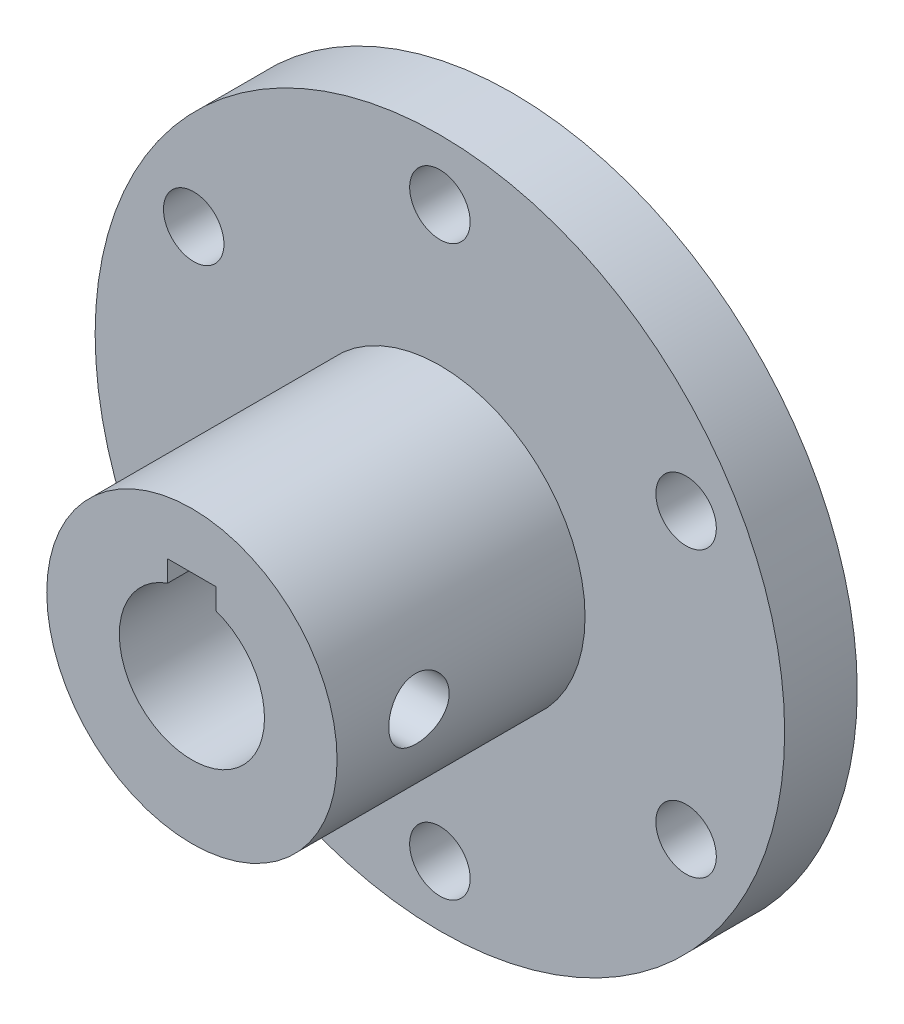
ISO-10303-21;
HEADER;
FILE_DESCRIPTION(('STEP AP214'),'2;1');
FILE_NAME('part.step','',(''),(''),'','','');
FILE_SCHEMA(('AUTOMOTIVE_DESIGN { 1 0 10303 214 1 1 1 1 }'));
ENDSEC;
DATA;
#1=APPLICATION_CONTEXT('core data for automotive mechanical design processes');
#2=APPLICATION_PROTOCOL_DEFINITION('international standard','automotive_design',2000,#1);
#3=PRODUCT_CONTEXT('',#1,'mechanical');
#4=PRODUCT('Part','Part','',(#3));
#5=PRODUCT_RELATED_PRODUCT_CATEGORY('part','',(#4));
#6=PRODUCT_DEFINITION_FORMATION('','',#4);
#7=PRODUCT_DEFINITION_CONTEXT('part definition',#1,'design');
#8=PRODUCT_DEFINITION('design','',#6,#7);
#9=PRODUCT_DEFINITION_SHAPE('','',#8);
#10=(LENGTH_UNIT() NAMED_UNIT(*) SI_UNIT(.MILLI.,.METRE.));
#11=(NAMED_UNIT(*) PLANE_ANGLE_UNIT() SI_UNIT($,.RADIAN.));
#12=(NAMED_UNIT(*) SI_UNIT($,.STERADIAN.) SOLID_ANGLE_UNIT());
#13=UNCERTAINTY_MEASURE_WITH_UNIT(LENGTH_MEASURE(1.E-05),#10,'distance_accuracy_value','');
#14=(GEOMETRIC_REPRESENTATION_CONTEXT(3) GLOBAL_UNCERTAINTY_ASSIGNED_CONTEXT((#13)) GLOBAL_UNIT_ASSIGNED_CONTEXT((#10,
#11,#12)) REPRESENTATION_CONTEXT('',''));
#15=CARTESIAN_POINT('',(0.,0.,0.));
#16=DIRECTION('',(0.,0.,1.));
#17=DIRECTION('',(1.,0.,0.));
#18=AXIS2_PLACEMENT_3D('',#15,#16,#17);
#19=CARTESIAN_POINT('',(0.,0.,0.));
#20=DIRECTION('',(0.,0.,1.));
#21=DIRECTION('',(1.,0.,0.));
#22=AXIS2_PLACEMENT_3D('',#19,#20,#21);
#23=PLANE('',#22);
#24=CARTESIAN_POINT('',(0.,0.,0.));
#25=DIRECTION('',(0.,0.,1.));
#26=DIRECTION('',(1.,0.,0.));
#27=AXIS2_PLACEMENT_3D('',#24,#25,#26);
#28=CIRCLE('',#27,28.5);
#29=CARTESIAN_POINT('',(28.5,0.,0.));
#30=VERTEX_POINT('',#29);
#31=EDGE_CURVE('E156',#30,#30,#28,.T.);
#32=ORIENTED_EDGE('',*,*,#31,.F.);
#33=EDGE_LOOP('',(#32));
#34=FACE_BOUND('',#33,.T.);
#35=CARTESIAN_POINT('',(-20.351596988934,11.7499999999994,0.));
#36=DIRECTION('',(0.,0.,1.));
#37=DIRECTION('',(1.,0.,0.));
#38=AXIS2_PLACEMENT_3D('',#35,#36,#37);
#39=CIRCLE('',#38,2.5);
#40=CARTESIAN_POINT('',(-17.851596988934,11.7499999999994,0.));
#41=VERTEX_POINT('',#40);
#42=EDGE_CURVE('E129',#41,#41,#39,.T.);
#43=ORIENTED_EDGE('',*,*,#42,.T.);
#44=EDGE_LOOP('',(#43));
#45=FACE_BOUND('',#44,.T.);
#46=CARTESIAN_POINT('',(20.3515969889352,-11.7499999999995,0.));
#47=DIRECTION('',(0.,0.,1.));
#48=DIRECTION('',(1.,0.,0.));
#49=AXIS2_PLACEMENT_3D('',#46,#47,#48);
#50=CIRCLE('',#49,2.5);
#51=CARTESIAN_POINT('',(22.8515969889352,-11.7499999999995,0.));
#52=VERTEX_POINT('',#51);
#53=EDGE_CURVE('E114',#52,#52,#50,.T.);
#54=ORIENTED_EDGE('',*,*,#53,.T.);
#55=EDGE_LOOP('',(#54));
#56=FACE_BOUND('',#55,.T.);
#57=CARTESIAN_POINT('',(1.23907396518432E-12,-23.5,0.));
#58=DIRECTION('',(0.,0.,1.));
#59=DIRECTION('',(1.,0.,0.));
#60=AXIS2_PLACEMENT_3D('',#57,#58,#59);
#61=CIRCLE('',#60,2.5);
#62=CARTESIAN_POINT('',(2.50000000000124,-23.5,0.));
#63=VERTEX_POINT('',#62);
#64=EDGE_CURVE('E247',#63,#63,#61,.T.);
#65=ORIENTED_EDGE('',*,*,#64,.T.);
#66=EDGE_LOOP('',(#65));
#67=FACE_BOUND('',#66,.T.);
#68=CARTESIAN_POINT('',(-20.3515969889334,-11.7500000000005,0.));
#69=DIRECTION('',(0.,0.,1.));
#70=DIRECTION('',(1.,0.,0.));
#71=AXIS2_PLACEMENT_3D('',#68,#69,#70);
#72=CIRCLE('',#71,2.5);
#73=CARTESIAN_POINT('',(-17.8515969889334,-11.7500000000005,0.));
#74=VERTEX_POINT('',#73);
#75=EDGE_CURVE('E249',#74,#74,#72,.T.);
#76=ORIENTED_EDGE('',*,*,#75,.T.);
#77=EDGE_LOOP('',(#76));
#78=FACE_BOUND('',#77,.T.);
#79=CARTESIAN_POINT('',(0.,23.5,0.));
#80=DIRECTION('',(0.,0.,1.));
#81=DIRECTION('',(1.,0.,0.));
#82=AXIS2_PLACEMENT_3D('',#79,#80,#81);
#83=CIRCLE('',#82,2.5);
#84=CARTESIAN_POINT('',(2.49999999999999,23.5,0.));
#85=VERTEX_POINT('',#84);
#86=EDGE_CURVE('E253',#85,#85,#83,.T.);
#87=ORIENTED_EDGE('',*,*,#86,.T.);
#88=EDGE_LOOP('',(#87));
#89=FACE_BOUND('',#88,.T.);
#90=CARTESIAN_POINT('',(20.3515969889346,11.7500000000005,0.));
#91=DIRECTION('',(0.,0.,1.));
#92=DIRECTION('',(1.,0.,0.));
#93=AXIS2_PLACEMENT_3D('',#90,#91,#92);
#94=CIRCLE('',#93,2.5);
#95=CARTESIAN_POINT('',(22.8515969889346,11.7500000000005,0.));
#96=VERTEX_POINT('',#95);
#97=EDGE_CURVE('E39',#96,#96,#94,.T.);
#98=ORIENTED_EDGE('',*,*,#97,.T.);
#99=EDGE_LOOP('',(#98));
#100=FACE_BOUND('',#99,.T.);
#101=DIRECTION('',(0.,-1.,0.));
#102=VECTOR('',#101,1.);
#103=CARTESIAN_POINT('',(2.,0.,0.));
#104=LINE('',#103,#102);
#105=CARTESIAN_POINT('',(2.,7.4,0.));
#106=VERTEX_POINT('',#105);
#107=CARTESIAN_POINT('',(2.,5.65685424949238,0.));
#108=VERTEX_POINT('',#107);
#109=EDGE_CURVE('E57',#106,#108,#104,.T.);
#110=ORIENTED_EDGE('',*,*,#109,.F.);
#111=DIRECTION('',(1.,0.,0.));
#112=VECTOR('',#111,1.);
#113=CARTESIAN_POINT('',(0.,7.4,0.));
#114=LINE('',#113,#112);
#115=CARTESIAN_POINT('',(-2.,7.4,0.));
#116=VERTEX_POINT('',#115);
#117=EDGE_CURVE('E105',#116,#106,#114,.T.);
#118=ORIENTED_EDGE('',*,*,#117,.F.);
#119=DIRECTION('',(0.,1.,0.));
#120=VECTOR('',#119,1.);
#121=CARTESIAN_POINT('',(-2.,0.,0.));
#122=LINE('',#121,#120);
#123=CARTESIAN_POINT('',(-2.,5.65685424949238,0.));
#124=VERTEX_POINT('',#123);
#125=EDGE_CURVE('E84',#124,#116,#122,.T.);
#126=ORIENTED_EDGE('',*,*,#125,.F.);
#127=CARTESIAN_POINT('',(0.,0.,0.));
#128=DIRECTION('',(0.,0.,1.));
#129=DIRECTION('',(1.,0.,0.));
#130=AXIS2_PLACEMENT_3D('',#127,#128,#129);
#131=CIRCLE('',#130,6.);
#132=EDGE_CURVE('E204',#124,#108,#131,.T.);
#133=ORIENTED_EDGE('',*,*,#132,.T.);
#134=EDGE_LOOP('',(#110,#118,#126,#133));
#135=FACE_BOUND('',#134,.T.);
#136=ADVANCED_FACE('F35',(#34,#45,#56,#67,#78,#89,#100,#135),#23,.F.);
#137=CARTESIAN_POINT('',(0.,0.,6.));
#138=DIRECTION('',(0.,0.,-1.));
#139=DIRECTION('',(-1.,0.,0.));
#140=AXIS2_PLACEMENT_3D('',#137,#138,#139);
#141=CYLINDRICAL_SURFACE('',#140,6.);
#142=CARTESIAN_POINT('',(5.42225065151419,2.56889039706912,19.7283273714897));
#143=CARTESIAN_POINT('',(5.42225195363247,2.56888891370338,19.6616191894606));
#144=CARTESIAN_POINT('',(5.4235138193724,2.56623067981336,19.5948925815696));
#145=CARTESIAN_POINT('',(5.42851428925408,2.55563284074856,19.4619408975699));
#146=CARTESIAN_POINT('',(5.43225436530629,2.54769009687566,19.3957161431899));
#147=CARTESIAN_POINT('',(5.44705154971853,2.51599296927434,19.1982755136197));
#148=CARTESIAN_POINT('',(5.46168510681385,2.48436997248092,19.0684905661244));
#149=CARTESIAN_POINT('',(5.49855540816879,2.40164355651586,18.8171726225907));
#150=CARTESIAN_POINT('',(5.52076112130537,2.35061954711991,18.6956083366361));
#151=CARTESIAN_POINT('',(5.57027327993751,2.23075098336058,18.4628172160337));
#152=CARTESIAN_POINT('',(5.59757851841122,2.16191064451292,18.351587944471));
#153=CARTESIAN_POINT('',(5.65618706374671,2.00375615049626,18.1356734162513));
#154=CARTESIAN_POINT('',(5.68762903099454,1.9135058875006,18.0317116032916));
#155=CARTESIAN_POINT('',(5.74999761965651,1.71701702186133,17.8399276389207));
#156=CARTESIAN_POINT('',(5.78092403821316,1.61077228331397,17.7521117103414));
#157=CARTESIAN_POINT('',(5.84050352272035,1.37961985035588,17.5914281537892));
#158=CARTESIAN_POINT('',(5.86899980201108,1.25410254701607,17.5193741030954));
#159=CARTESIAN_POINT('',(5.91904811145496,0.991320893666393,17.3977754246359));
#160=CARTESIAN_POINT('',(5.940603223003,0.854061790543748,17.348220804674));
#161=CARTESIAN_POINT('',(5.97349224286801,0.579250443236474,17.2756484865349));
#162=CARTESIAN_POINT('',(5.98529968211897,0.442085163424809,17.2513840242942));
#163=CARTESIAN_POINT('',(5.99932572945772,0.165165828999258,17.2260521395105));
#164=CARTESIAN_POINT('',(6.00154822668798,0.0254128474805444,17.2249753077516));
#165=CARTESIAN_POINT('',(5.99646999537446,-0.243647058056589,17.2453959796862));
#166=CARTESIAN_POINT('',(5.9897406094826,-0.373072098827291,17.2655236193667));
#167=CARTESIAN_POINT('',(5.96854657036551,-0.626611714643536,17.3254336235311));
#168=CARTESIAN_POINT('',(5.95408134689086,-0.750725897469163,17.365217436959));
#169=CARTESIAN_POINT('',(5.9186425609577,-0.992383643529205,17.4637834983214));
#170=CARTESIAN_POINT('',(5.89757306894909,-1.10979806975317,17.5228463416616));
#171=CARTESIAN_POINT('',(5.85107425107116,-1.333414193718,17.6580189278126));
#172=CARTESIAN_POINT('',(5.82564338513003,-1.43961190917841,17.7341346952059));
#173=CARTESIAN_POINT('',(5.77094344384917,-1.64571255992642,17.9074922520631));
#174=CARTESIAN_POINT('',(5.74153017540904,-1.74464412809922,18.0058449923935));
#175=CARTESIAN_POINT('',(5.68359773086639,-1.92502238908887,18.2177502881529));
#176=CARTESIAN_POINT('',(5.65507890339245,-2.00646233473593,18.3313086816461));
#177=CARTESIAN_POINT('',(5.60134161994031,-2.15202349999705,18.5751174742253));
#178=CARTESIAN_POINT('',(5.57626243921726,-2.2154875532682,18.7057938098604));
#179=CARTESIAN_POINT('',(5.53401615508048,-2.31901456949934,18.977289483192));
#180=CARTESIAN_POINT('',(5.51684339617688,-2.35909426486993,19.1181014871793));
#181=CARTESIAN_POINT('',(5.49382073077735,-2.41220306587435,19.3961210032707));
#182=CARTESIAN_POINT('',(5.48730847785058,-2.42681851860183,19.5329696274007));
#183=CARTESIAN_POINT('',(5.48446788513199,-2.43323533232134,19.807284342521));
#184=CARTESIAN_POINT('',(5.48813602208797,-2.4250445861307,19.944750203457));
#185=CARTESIAN_POINT('',(5.50454748532928,-2.38753425532214,20.2071241413387));
#186=CARTESIAN_POINT('',(5.51669475852596,-2.35960096819507,20.3322727420665));
#187=CARTESIAN_POINT('',(5.54790527453022,-2.28524845036873,20.5760299575616));
#188=CARTESIAN_POINT('',(5.56697013378883,-2.23882489875145,20.6946370362851));
#189=CARTESIAN_POINT('',(5.61080466094886,-2.12664821688557,20.9275579793434));
#190=CARTESIAN_POINT('',(5.63578173303694,-2.06015974520393,21.0414773058101));
#191=CARTESIAN_POINT('',(5.68825702491187,-1.91050093057222,21.2571434576004));
#192=CARTESIAN_POINT('',(5.71575633306032,-1.82732336760903,21.3588849840602));
#193=CARTESIAN_POINT('',(5.77279313281953,-1.63869563914231,21.5559276161034));
#194=CARTESIAN_POINT('',(5.80231430286949,-1.53198354204752,21.6500301439234));
#195=CARTESIAN_POINT('',(5.85785015120914,-1.30360544474086,21.8192719236762));
#196=CARTESIAN_POINT('',(5.88386457245475,-1.18193834957853,21.8944097858541));
#197=CARTESIAN_POINT('',(5.92949399829139,-0.926273991762149,22.023507084567));
#198=CARTESIAN_POINT('',(5.94909245059206,-0.792245962499117,22.077411814234));
#199=CARTESIAN_POINT('',(5.97937965670684,-0.516017484669512,22.1615609137531));
#200=CARTESIAN_POINT('',(5.9900737133468,-0.373821954105474,22.191819364989));
#201=CARTESIAN_POINT('',(6.00072855105519,-0.0960287639170519,22.2260435754152));
#202=CARTESIAN_POINT('',(6.00138732410508,0.0393353363783025,22.2316993203226));
#203=CARTESIAN_POINT('',(5.99355821627965,0.308919580768309,22.2211010445474));
#204=CARTESIAN_POINT('',(5.98507193891218,0.443139921253078,22.2048508647597));
#205=CARTESIAN_POINT('',(5.96019063893748,0.701727759956212,22.1521151651253));
#206=CARTESIAN_POINT('',(5.94408684637824,0.826275874243718,22.1163679131032));
#207=CARTESIAN_POINT('',(5.90554194628013,1.06747634890412,22.0264588767995));
#208=CARTESIAN_POINT('',(5.88309963504297,1.18412720434945,21.9722935944957));
#209=CARTESIAN_POINT('',(5.83269791774769,1.41204594523301,21.844348075925));
#210=CARTESIAN_POINT('',(5.8045350120352,1.52283230075625,21.7697920004772));
#211=CARTESIAN_POINT('',(5.74596844859753,1.73076106992463,21.6043136804161));
#212=CARTESIAN_POINT('',(5.71556396151426,1.82789839457439,21.5133853601415));
#213=CARTESIAN_POINT('',(5.65325583306173,2.01267168702113,21.3104347980214));
#214=CARTESIAN_POINT('',(5.62139096185819,2.09921134603455,21.197398217493));
#215=CARTESIAN_POINT('',(5.56182667596352,2.25229911434537,20.957420940768));
#216=CARTESIAN_POINT('',(5.53412959410159,2.31883604818895,20.8304725259181));
#217=CARTESIAN_POINT('',(5.48652018637099,2.4293507632457,20.5663984055381));
#218=CARTESIAN_POINT('',(5.46656661291974,2.47344847486282,20.429331386265));
#219=CARTESIAN_POINT('',(5.44444541447372,2.52156700189772,20.219163576403));
#220=CARTESIAN_POINT('',(5.43837530851026,2.53459793579417,20.14841674891));
#221=CARTESIAN_POINT('',(5.42903044176588,2.5545564390546,20.0059012933206));
#222=CARTESIAN_POINT('',(5.42575370698212,2.56148831857326,19.9341334232931));
#223=CARTESIAN_POINT('',(5.42281360714943,2.56770222979306,19.817615753322));
#224=CARTESIAN_POINT('',(5.42224977999604,2.56889138989764,19.7729756895517));
#225=CARTESIAN_POINT('',(5.42225065151419,2.56889039706912,19.7283273714897));
#226=B_SPLINE_CURVE_WITH_KNOTS('',3,(#142,#143,#144,#145,#146,#147,#148,#149,#150,#151,#152,
#153,#154,#155,#156,#157,#158,#159,#160,#161,#162,#163,#164,#165,#166,#167,#168,#169,#170,#171,
#172,#173,#174,#175,#176,#177,#178,#179,#180,#181,#182,#183,#184,#185,#186,#187,#188,#189,#190,
#191,#192,#193,#194,#195,#196,#197,#198,#199,#200,#201,#202,#203,#204,#205,#206,#207,#208,#209,
#210,#211,#212,#213,#214,#215,#216,#217,#218,#219,#220,#221,#222,#223,#224,#225),.UNSPECIFIED.,
.T.,.F.,(4,2,2,2,2,2,2,2,2,2,2,2,2,2,2,2,2,2,2,2,2,2,2,2,2,2,2,2,2,2,2,2,2,2,2,2,2,2,2,2,2,4),
(0.,0.200084571722602,0.40028808850647,0.801278981491035,1.20064595545063,1.59991852157746,
2.02172146517307,2.44368663783436,2.88395415111786,3.32402594599146,3.74119672221696,
4.1581982131907,4.54982139332094,4.94147344604321,5.33910086827409,5.73686898938565,
6.16267519792101,6.58864536193866,7.02861545732426,7.4682703498081,7.87940009324659,
8.29038756972473,8.67506253483715,9.05982744593784,9.4608870376338,9.86212051077543,
10.2960177411853,10.7299467589135,11.1649865881391,11.5997671528547,12.0041571544237,
12.4084762611349,12.7984527395887,13.1885033252651,13.5961816825436,14.0040116402728,
14.4395929491203,14.8754171654048,15.3088869092924,15.5252055348317,15.7413711665975,
15.8752893656223),.UNSPECIFIED.);
#227=CARTESIAN_POINT('',(5.42225065151419,2.56889039706912,19.7283273714897));
#228=VERTEX_POINT('',#227);
#229=EDGE_CURVE('E130',#228,#228,#226,.T.);
#230=ORIENTED_EDGE('',*,*,#229,.F.);
#231=EDGE_LOOP('',(#230));
#232=FACE_BOUND('',#231,.T.);
#233=CARTESIAN_POINT('',(0.,0.,26.5));
#234=DIRECTION('',(0.,0.,1.));
#235=DIRECTION('',(1.,0.,0.));
#236=AXIS2_PLACEMENT_3D('',#233,#234,#235);
#237=CIRCLE('',#236,6.);
#238=CARTESIAN_POINT('',(-2.,5.65685424949238,26.5));
#239=VERTEX_POINT('',#238);
#240=CARTESIAN_POINT('',(2.,5.65685424949238,26.5));
#241=VERTEX_POINT('',#240);
#242=EDGE_CURVE('E98',#239,#241,#237,.T.);
#243=ORIENTED_EDGE('',*,*,#242,.T.);
#244=DIRECTION('',(0.,0.,1.));
#245=VECTOR('',#244,1.);
#246=CARTESIAN_POINT('',(2.,5.65685424949238,-73.5));
#247=LINE('',#246,#245);
#248=EDGE_CURVE('E103',#108,#241,#247,.T.);
#249=ORIENTED_EDGE('',*,*,#248,.F.);
#250=ORIENTED_EDGE('',*,*,#132,.F.);
#251=DIRECTION('',(0.,0.,1.));
#252=VECTOR('',#251,1.);
#253=CARTESIAN_POINT('',(-2.,5.65685424949238,-73.5));
#254=LINE('',#253,#252);
#255=EDGE_CURVE('E87',#124,#239,#254,.T.);
#256=ORIENTED_EDGE('',*,*,#255,.T.);
#257=EDGE_LOOP('',(#243,#249,#250,#256));
#258=FACE_BOUND('',#257,.T.);
#259=ADVANCED_FACE('F138',(#232,#258),#141,.F.);
#260=CARTESIAN_POINT('',(0.,0.,26.5));
#261=DIRECTION('',(0.,0.,1.));
#262=DIRECTION('',(1.,0.,0.));
#263=AXIS2_PLACEMENT_3D('',#260,#261,#262);
#264=PLANE('',#263);
#265=CARTESIAN_POINT('',(0.,0.,26.5));
#266=DIRECTION('',(0.,0.,1.));
#267=DIRECTION('',(1.,0.,0.));
#268=AXIS2_PLACEMENT_3D('',#265,#266,#267);
#269=CIRCLE('',#268,12.);
#270=CARTESIAN_POINT('',(12.,0.,26.5));
#271=VERTEX_POINT('',#270);
#272=EDGE_CURVE('E201',#271,#271,#269,.T.);
#273=ORIENTED_EDGE('',*,*,#272,.T.);
#274=EDGE_LOOP('',(#273));
#275=FACE_BOUND('',#274,.T.);
#276=DIRECTION('',(1.,0.,0.));
#277=VECTOR('',#276,1.);
#278=CARTESIAN_POINT('',(0.,7.4,26.5));
#279=LINE('',#278,#277);
#280=CARTESIAN_POINT('',(-2.,7.4,26.5));
#281=VERTEX_POINT('',#280);
#282=CARTESIAN_POINT('',(2.,7.4,26.5));
#283=VERTEX_POINT('',#282);
#284=EDGE_CURVE('E91',#281,#283,#279,.T.);
#285=ORIENTED_EDGE('',*,*,#284,.T.);
#286=DIRECTION('',(0.,-1.,0.));
#287=VECTOR('',#286,1.);
#288=CARTESIAN_POINT('',(2.,0.,26.5));
#289=LINE('',#288,#287);
#290=EDGE_CURVE('E52',#283,#241,#289,.T.);
#291=ORIENTED_EDGE('',*,*,#290,.T.);
#292=ORIENTED_EDGE('',*,*,#242,.F.);
#293=DIRECTION('',(0.,1.,0.));
#294=VECTOR('',#293,1.);
#295=CARTESIAN_POINT('',(-2.,0.,26.5));
#296=LINE('',#295,#294);
#297=EDGE_CURVE('E81',#239,#281,#296,.T.);
#298=ORIENTED_EDGE('',*,*,#297,.T.);
#299=EDGE_LOOP('',(#285,#291,#292,#298));
#300=FACE_BOUND('',#299,.T.);
#301=ADVANCED_FACE('F96',(#275,#300),#264,.T.);
#302=CARTESIAN_POINT('',(0.,0.,6.));
#303=DIRECTION('',(0.,0.,1.));
#304=DIRECTION('',(1.,0.,0.));
#305=AXIS2_PLACEMENT_3D('',#302,#303,#304);
#306=PLANE('',#305);
#307=CARTESIAN_POINT('',(20.3515969889346,11.7500000000005,6.));
#308=DIRECTION('',(0.,0.,1.));
#309=DIRECTION('',(1.,0.,0.));
#310=AXIS2_PLACEMENT_3D('',#307,#308,#309);
#311=CIRCLE('',#310,2.5);
#312=CARTESIAN_POINT('',(22.8515969889346,11.7500000000005,6.));
#313=VERTEX_POINT('',#312);
#314=EDGE_CURVE('E111',#313,#313,#311,.T.);
#315=ORIENTED_EDGE('',*,*,#314,.F.);
#316=EDGE_LOOP('',(#315));
#317=FACE_BOUND('',#316,.T.);
#318=CARTESIAN_POINT('',(0.,23.5,6.));
#319=DIRECTION('',(0.,0.,1.));
#320=DIRECTION('',(1.,0.,0.));
#321=AXIS2_PLACEMENT_3D('',#318,#319,#320);
#322=CIRCLE('',#321,2.5);
#323=CARTESIAN_POINT('',(2.49999999999999,23.5,6.));
#324=VERTEX_POINT('',#323);
#325=EDGE_CURVE('E115',#324,#324,#322,.T.);
#326=ORIENTED_EDGE('',*,*,#325,.F.);
#327=EDGE_LOOP('',(#326));
#328=FACE_BOUND('',#327,.T.);
#329=CARTESIAN_POINT('',(-20.3515969889334,-11.7500000000005,6.));
#330=DIRECTION('',(0.,0.,1.));
#331=DIRECTION('',(1.,0.,0.));
#332=AXIS2_PLACEMENT_3D('',#329,#330,#331);
#333=CIRCLE('',#332,2.5);
#334=CARTESIAN_POINT('',(-17.8515969889334,-11.7500000000005,6.));
#335=VERTEX_POINT('',#334);
#336=EDGE_CURVE('E118',#335,#335,#333,.T.);
#337=ORIENTED_EDGE('',*,*,#336,.F.);
#338=EDGE_LOOP('',(#337));
#339=FACE_BOUND('',#338,.T.);
#340=CARTESIAN_POINT('',(1.23907396518432E-12,-23.5,6.));
#341=DIRECTION('',(0.,0.,1.));
#342=DIRECTION('',(1.,0.,0.));
#343=AXIS2_PLACEMENT_3D('',#340,#341,#342);
#344=CIRCLE('',#343,2.5);
#345=CARTESIAN_POINT('',(2.50000000000124,-23.5,6.));
#346=VERTEX_POINT('',#345);
#347=EDGE_CURVE('E121',#346,#346,#344,.T.);
#348=ORIENTED_EDGE('',*,*,#347,.F.);
#349=EDGE_LOOP('',(#348));
#350=FACE_BOUND('',#349,.T.);
#351=CARTESIAN_POINT('',(20.3515969889352,-11.7499999999995,6.));
#352=DIRECTION('',(0.,0.,1.));
#353=DIRECTION('',(1.,0.,0.));
#354=AXIS2_PLACEMENT_3D('',#351,#352,#353);
#355=CIRCLE('',#354,2.5);
#356=CARTESIAN_POINT('',(22.8515969889352,-11.7499999999995,6.));
#357=VERTEX_POINT('',#356);
#358=EDGE_CURVE('E110',#357,#357,#355,.T.);
#359=ORIENTED_EDGE('',*,*,#358,.F.);
#360=EDGE_LOOP('',(#359));
#361=FACE_BOUND('',#360,.T.);
#362=CARTESIAN_POINT('',(-20.351596988934,11.7499999999994,6.));
#363=DIRECTION('',(0.,0.,1.));
#364=DIRECTION('',(1.,0.,0.));
#365=AXIS2_PLACEMENT_3D('',#362,#363,#364);
#366=CIRCLE('',#365,2.5);
#367=CARTESIAN_POINT('',(-17.851596988934,11.7499999999994,6.));
#368=VERTEX_POINT('',#367);
#369=EDGE_CURVE('E126',#368,#368,#366,.T.);
#370=ORIENTED_EDGE('',*,*,#369,.F.);
#371=EDGE_LOOP('',(#370));
#372=FACE_BOUND('',#371,.T.);
#373=CARTESIAN_POINT('',(0.,0.,6.));
#374=DIRECTION('',(0.,0.,1.));
#375=DIRECTION('',(1.,0.,0.));
#376=AXIS2_PLACEMENT_3D('',#373,#374,#375);
#377=CIRCLE('',#376,28.5);
#378=CARTESIAN_POINT('',(28.5,0.,6.));
#379=VERTEX_POINT('',#378);
#380=EDGE_CURVE('E44',#379,#379,#377,.T.);
#381=ORIENTED_EDGE('',*,*,#380,.T.);
#382=EDGE_LOOP('',(#381));
#383=FACE_BOUND('',#382,.T.);
#384=CARTESIAN_POINT('',(0.,0.,6.));
#385=DIRECTION('',(0.,0.,1.));
#386=DIRECTION('',(1.,0.,0.));
#387=AXIS2_PLACEMENT_3D('',#384,#385,#386);
#388=CIRCLE('',#387,12.);
#389=CARTESIAN_POINT('',(12.,0.,6.));
#390=VERTEX_POINT('',#389);
#391=EDGE_CURVE('E199',#390,#390,#388,.T.);
#392=ORIENTED_EDGE('',*,*,#391,.F.);
#393=EDGE_LOOP('',(#392));
#394=FACE_BOUND('',#393,.T.);
#395=ADVANCED_FACE('F165',(#317,#328,#339,#350,#361,#372,#383,#394),#306,.T.);
#396=CARTESIAN_POINT('',(0.,0.,6.));
#397=DIRECTION('',(0.,0.,-1.));
#398=DIRECTION('',(-1.,0.,0.));
#399=AXIS2_PLACEMENT_3D('',#396,#397,#398);
#400=CYLINDRICAL_SURFACE('',#399,28.5);
#401=ORIENTED_EDGE('',*,*,#380,.F.);
#402=EDGE_LOOP('',(#401));
#403=FACE_BOUND('',#402,.T.);
#404=ORIENTED_EDGE('',*,*,#31,.T.);
#405=EDGE_LOOP('',(#404));
#406=FACE_BOUND('',#405,.T.);
#407=ADVANCED_FACE('F37',(#403,#406),#400,.T.);
#408=CARTESIAN_POINT('',(0.,0.,26.5));
#409=DIRECTION('',(0.,0.,-1.));
#410=DIRECTION('',(-1.,0.,0.));
#411=AXIS2_PLACEMENT_3D('',#408,#409,#410);
#412=CYLINDRICAL_SURFACE('',#411,12.);
#413=CARTESIAN_POINT('',(11.7040851369453,2.64846957829154,19.7283273714897));
#414=CARTESIAN_POINT('',(11.7040879898294,2.64846463158552,19.5895461437328));
#415=CARTESIAN_POINT('',(11.7067201419506,2.63690661741086,19.4507034325521));
#416=CARTESIAN_POINT('',(11.7169595947243,2.59102103722069,19.1769547469654));
#417=CARTESIAN_POINT('',(11.7245707089772,2.55667601737375,19.0420518730567));
#418=CARTESIAN_POINT('',(11.7439068142649,2.46632734443664,18.7801826431899));
#419=CARTESIAN_POINT('',(11.7556275294412,2.41034619661594,18.6532081991967));
#420=CARTESIAN_POINT('',(11.7819165657679,2.27836556360275,18.410478396332));
#421=CARTESIAN_POINT('',(11.7964847718226,2.20236688747716,18.2947225842853));
#422=CARTESIAN_POINT('',(11.8271574813997,2.03125184109687,18.0759366515221));
#423=CARTESIAN_POINT('',(11.8432803705811,1.93588673306604,17.9731036165269));
#424=CARTESIAN_POINT('',(11.875207271725,1.72926591953192,17.7848052700731));
#425=CARTESIAN_POINT('',(11.8910112602234,1.61800904957398,17.6993412324251));
#426=CARTESIAN_POINT('',(11.920820283367,1.38143746330646,17.5474356358068));
#427=CARTESIAN_POINT('',(11.9348068161954,1.25599932121095,17.481182360361));
#428=CARTESIAN_POINT('',(11.959357253839,0.99542764926943,17.3707953097769));
#429=CARTESIAN_POINT('',(11.9699215065425,0.860295106604191,17.3266592860836));
#430=CARTESIAN_POINT('',(11.986447931398,0.586206692126339,17.2623758954625));
#431=CARTESIAN_POINT('',(11.9924735888566,0.447332833885118,17.2418953837383));
#432=CARTESIAN_POINT('',(11.9996369444103,0.167998102693716,17.2244640270413));
#433=CARTESIAN_POINT('',(12.000775151835,0.027537396641308,17.2275107301648));
#434=CARTESIAN_POINT('',(11.9982059852361,-0.248690317262629,17.2567966200334));
#435=CARTESIAN_POINT('',(11.9945731830999,-0.384496312909534,17.2826768556294));
#436=CARTESIAN_POINT('',(11.9831275454121,-0.649847816056063,17.3563246671835));
#437=CARTESIAN_POINT('',(11.9753145328201,-0.779393058146788,17.4040931701416));
#438=CARTESIAN_POINT('',(11.9564160570279,-1.02954914904287,17.5204875180442));
#439=CARTESIAN_POINT('',(11.9453088564648,-1.15009377377728,17.5892520010489));
#440=CARTESIAN_POINT('',(11.9211589111654,-1.37809061549998,17.7455834156502));
#441=CARTESIAN_POINT('',(11.9081159258525,-1.48554120215244,17.8331526848848));
#442=CARTESIAN_POINT('',(11.8813493763249,-1.68642111334851,18.0265706548643));
#443=CARTESIAN_POINT('',(11.8676176086688,-1.7795470936112,18.132733523135));
#444=CARTESIAN_POINT('',(11.8413467577601,-1.94671224818358,18.3592914970511));
#445=CARTESIAN_POINT('',(11.8288077010789,-2.02075099732805,18.4796869196374));
#446=CARTESIAN_POINT('',(11.8064129573346,-2.14774328190094,18.7317519018621));
#447=CARTESIAN_POINT('',(11.7965640047837,-2.20064405003921,18.863448691129));
#448=CARTESIAN_POINT('',(11.7808217696795,-2.28342553977681,19.1341106233868));
#449=CARTESIAN_POINT('',(11.7749279234644,-2.31330954169917,19.2730747276325));
#450=CARTESIAN_POINT('',(11.7679116181316,-2.34874003957745,19.55156678945));
#451=CARTESIAN_POINT('',(11.7667027365326,-2.35472741380539,19.6910365433174));
#452=CARTESIAN_POINT('',(11.7689672179853,-2.34338282954182,19.9689789921857));
#453=CARTESIAN_POINT('',(11.77244029135,-2.32605231380057,20.1074517483409));
#454=CARTESIAN_POINT('',(11.7835772521436,-2.26894908918204,20.3779683936815));
#455=CARTESIAN_POINT('',(11.7911965417844,-2.22941506441245,20.510064693518));
#456=CARTESIAN_POINT('',(11.8096863000226,-2.12929221050942,20.7657753333648));
#457=CARTESIAN_POINT('',(11.8205570555937,-2.06870152284316,20.8893889235087));
#458=CARTESIAN_POINT('',(11.8444525728398,-1.92721135812349,21.1265402301861));
#459=CARTESIAN_POINT('',(11.8575054830138,-1.84603819504165,21.2399117545139));
#460=CARTESIAN_POINT('',(11.8841274183886,-1.66606476154226,21.4516138397942));
#461=CARTESIAN_POINT('',(11.8976965013225,-1.56726251475193,21.5499427120371));
#462=CARTESIAN_POINT('',(11.9239921017402,-1.3528666881955,21.730452762101));
#463=CARTESIAN_POINT('',(11.9367006756297,-1.23701932811414,21.8123355242501));
#464=CARTESIAN_POINT('',(11.9594720028987,-0.992987695480591,21.9555048353279));
#465=CARTESIAN_POINT('',(11.9695348731782,-0.864803968351206,22.0167922942907));
#466=CARTESIAN_POINT('',(11.9856913065198,-0.600508121581499,22.11660468621));
#467=CARTESIAN_POINT('',(11.991808614908,-0.464448905421611,22.1552656577539));
#468=CARTESIAN_POINT('',(11.999330870551,-0.18764479594798,22.2091561333018));
#469=CARTESIAN_POINT('',(12.00073643617,-0.046900519945267,22.2243887118814));
#470=CARTESIAN_POINT('',(11.9985465683357,0.232432452627378,22.230862568439));
#471=CARTESIAN_POINT('',(11.99504500029,0.371011711080982,22.2225511243022));
#472=CARTESIAN_POINT('',(11.9834525167589,0.644693376783257,22.183166047356));
#473=CARTESIAN_POINT('',(11.9753616693576,0.779795835580693,22.1520927522267));
#474=CARTESIAN_POINT('',(11.9553643394085,1.0423876706309,22.0682717368827));
#475=CARTESIAN_POINT('',(11.9434680829082,1.16989637607198,22.0155819992296));
#476=CARTESIAN_POINT('',(11.9170010497318,1.4142887525484,21.8900825333383));
#477=CARTESIAN_POINT('',(11.9024300402189,1.53117149727015,21.8172710532267));
#478=CARTESIAN_POINT('',(11.8717763869562,1.75320257908609,21.6521079965527));
#479=CARTESIAN_POINT('',(11.8556718694963,1.85811162063139,21.5594387579584));
#480=CARTESIAN_POINT('',(11.8238235482133,2.05104388590823,21.3578383354381));
#481=CARTESIAN_POINT('',(11.8080798313126,2.1390630775055,21.2489032793635));
#482=CARTESIAN_POINT('',(11.7784358391851,2.29673221377671,21.0163091385164));
#483=CARTESIAN_POINT('',(11.7645596831021,2.36615153623414,20.8924905227654));
#484=CARTESIAN_POINT('',(11.7404286356207,2.48312924372428,20.6346770382273));
#485=CARTESIAN_POINT('',(11.7301705559858,2.5307068867773,20.5006912558858));
#486=CARTESIAN_POINT('',(11.7163647324167,2.593751819837,20.2601147947692));
#487=CARTESIAN_POINT('',(11.7117881063708,2.61423338719983,20.1548682874003));
#488=CARTESIAN_POINT('',(11.7056472682292,2.64159390175226,19.942535804965));
#489=CARTESIAN_POINT('',(11.7040829348595,2.64847339655779,19.8354499041272));
#490=CARTESIAN_POINT('',(11.7040851369453,2.64846957829154,19.7283273714897));
#491=B_SPLINE_CURVE_WITH_KNOTS('',3,(#413,#414,#415,#416,#417,#418,#419,#420,#421,#422,#423,
#424,#425,#426,#427,#428,#429,#430,#431,#432,#433,#434,#435,#436,#437,#438,#439,#440,#441,#442,
#443,#444,#445,#446,#447,#448,#449,#450,#451,#452,#453,#454,#455,#456,#457,#458,#459,#460,#461,
#462,#463,#464,#465,#466,#467,#468,#469,#470,#471,#472,#473,#474,#475,#476,#477,#478,#479,#480,
#481,#482,#483,#484,#485,#486,#487,#488,#489,#490),.UNSPECIFIED.,.T.,.F.,(4,2,2,2,2,2,2,2,2,2,2,
2,2,2,2,2,2,2,2,2,2,2,2,2,2,2,2,2,2,2,2,2,2,2,2,2,2,2,4),(0.,0.415951300512119,
0.832221569574943,1.24806000673265,1.66388163914322,2.08542663093376,2.50700252691671,
2.93258047080632,3.35811513944078,3.77758090665767,4.1970029595718,4.60994674251006,
5.0229080158333,5.4386573386718,5.85445837359217,6.27811712836326,6.70178531925467,
7.12650461393728,7.55116336690853,7.96795017166199,8.3847111897077,8.79707556100215,
9.20947633822898,9.62767817991883,10.0459269351443,10.4711889804267,10.8964322324007,
11.3190917821618,11.7416958603572,12.1563256520416,12.570949292672,12.984467970239,
13.3980226616229,13.8187661227776,14.2396099039013,14.6654527543522,15.090919410474,
15.4119970625272,15.733061787814),.UNSPECIFIED.);
#492=CARTESIAN_POINT('',(11.7040851369453,2.64846957829154,19.7283273714897));
#493=VERTEX_POINT('',#492);
#494=EDGE_CURVE('E11',#493,#493,#491,.T.);
#495=ORIENTED_EDGE('',*,*,#494,.T.);
#496=EDGE_LOOP('',(#495));
#497=FACE_BOUND('',#496,.T.);
#498=ORIENTED_EDGE('',*,*,#272,.F.);
#499=EDGE_LOOP('',(#498));
#500=FACE_BOUND('',#499,.T.);
#501=ORIENTED_EDGE('',*,*,#391,.T.);
#502=EDGE_LOOP('',(#501));
#503=FACE_BOUND('',#502,.T.);
#504=ADVANCED_FACE('F148',(#497,#500,#503),#412,.T.);
#505=CARTESIAN_POINT('',(11.9990372247085,0.152005526413377,19.7283273714897));
#506=DIRECTION('',(0.999919768725707,0.0126671272011148,0.));
#507=DIRECTION('',(-0.0126671272011148,0.999919768725707,0.));
#508=AXIS2_PLACEMENT_3D('',#505,#506,#507);
#509=CYLINDRICAL_SURFACE('',#508,2.49999995299999);
#510=ORIENTED_EDGE('',*,*,#229,.T.);
#511=EDGE_LOOP('',(#510));
#512=FACE_BOUND('',#511,.T.);
#513=ORIENTED_EDGE('',*,*,#494,.F.);
#514=EDGE_LOOP('',(#513));
#515=FACE_BOUND('',#514,.T.);
#516=ADVANCED_FACE('F142',(#512,#515),#509,.F.);
#517=CARTESIAN_POINT('',(-20.351596988934,11.7499999999994,-24.));
#518=DIRECTION('',(0.,0.,1.));
#519=DIRECTION('',(1.,0.,0.));
#520=AXIS2_PLACEMENT_3D('',#517,#518,#519);
#521=CYLINDRICAL_SURFACE('',#520,2.5);
#522=ORIENTED_EDGE('',*,*,#369,.T.);
#523=EDGE_LOOP('',(#522));
#524=FACE_BOUND('',#523,.T.);
#525=ORIENTED_EDGE('',*,*,#42,.F.);
#526=EDGE_LOOP('',(#525));
#527=FACE_BOUND('',#526,.T.);
#528=ADVANCED_FACE('F147',(#524,#527),#521,.F.);
#529=CARTESIAN_POINT('',(20.3515969889352,-11.7499999999995,-24.));
#530=DIRECTION('',(0.,0.,1.));
#531=DIRECTION('',(1.,0.,0.));
#532=AXIS2_PLACEMENT_3D('',#529,#530,#531);
#533=CYLINDRICAL_SURFACE('',#532,2.5);
#534=ORIENTED_EDGE('',*,*,#358,.T.);
#535=EDGE_LOOP('',(#534));
#536=FACE_BOUND('',#535,.T.);
#537=ORIENTED_EDGE('',*,*,#53,.F.);
#538=EDGE_LOOP('',(#537));
#539=FACE_BOUND('',#538,.T.);
#540=ADVANCED_FACE('F235',(#536,#539),#533,.F.);
#541=CARTESIAN_POINT('',(1.23907396518432E-12,-23.5,-24.));
#542=DIRECTION('',(0.,0.,1.));
#543=DIRECTION('',(1.,0.,0.));
#544=AXIS2_PLACEMENT_3D('',#541,#542,#543);
#545=CYLINDRICAL_SURFACE('',#544,2.5);
#546=ORIENTED_EDGE('',*,*,#347,.T.);
#547=EDGE_LOOP('',(#546));
#548=FACE_BOUND('',#547,.T.);
#549=ORIENTED_EDGE('',*,*,#64,.F.);
#550=EDGE_LOOP('',(#549));
#551=FACE_BOUND('',#550,.T.);
#552=ADVANCED_FACE('F232',(#548,#551),#545,.F.);
#553=CARTESIAN_POINT('',(-20.3515969889334,-11.7500000000005,-24.));
#554=DIRECTION('',(0.,0.,1.));
#555=DIRECTION('',(1.,0.,0.));
#556=AXIS2_PLACEMENT_3D('',#553,#554,#555);
#557=CYLINDRICAL_SURFACE('',#556,2.5);
#558=ORIENTED_EDGE('',*,*,#336,.T.);
#559=EDGE_LOOP('',(#558));
#560=FACE_BOUND('',#559,.T.);
#561=ORIENTED_EDGE('',*,*,#75,.F.);
#562=EDGE_LOOP('',(#561));
#563=FACE_BOUND('',#562,.T.);
#564=ADVANCED_FACE('F228',(#560,#563),#557,.F.);
#565=CARTESIAN_POINT('',(0.,23.5,-24.));
#566=DIRECTION('',(0.,0.,1.));
#567=DIRECTION('',(1.,0.,0.));
#568=AXIS2_PLACEMENT_3D('',#565,#566,#567);
#569=CYLINDRICAL_SURFACE('',#568,2.5);
#570=ORIENTED_EDGE('',*,*,#325,.T.);
#571=EDGE_LOOP('',(#570));
#572=FACE_BOUND('',#571,.T.);
#573=ORIENTED_EDGE('',*,*,#86,.F.);
#574=EDGE_LOOP('',(#573));
#575=FACE_BOUND('',#574,.T.);
#576=ADVANCED_FACE('F221',(#572,#575),#569,.F.);
#577=CARTESIAN_POINT('',(20.3515969889346,11.7500000000005,-24.));
#578=DIRECTION('',(0.,0.,1.));
#579=DIRECTION('',(1.,0.,0.));
#580=AXIS2_PLACEMENT_3D('',#577,#578,#579);
#581=CYLINDRICAL_SURFACE('',#580,2.5);
#582=ORIENTED_EDGE('',*,*,#314,.T.);
#583=EDGE_LOOP('',(#582));
#584=FACE_BOUND('',#583,.T.);
#585=ORIENTED_EDGE('',*,*,#97,.F.);
#586=EDGE_LOOP('',(#585));
#587=FACE_BOUND('',#586,.T.);
#588=ADVANCED_FACE('F214',(#584,#587),#581,.F.);
#589=CARTESIAN_POINT('',(2.,0.,-73.5));
#590=DIRECTION('',(-1.,0.,0.));
#591=DIRECTION('',(0.,0.,1.));
#592=AXIS2_PLACEMENT_3D('',#589,#590,#591);
#593=PLANE('',#592);
#594=ORIENTED_EDGE('',*,*,#109,.T.);
#595=ORIENTED_EDGE('',*,*,#248,.T.);
#596=ORIENTED_EDGE('',*,*,#290,.F.);
#597=DIRECTION('',(0.,0.,1.));
#598=VECTOR('',#597,1.);
#599=CARTESIAN_POINT('',(2.,7.4,-73.5));
#600=LINE('',#599,#598);
#601=EDGE_CURVE('E88',#106,#283,#600,.T.);
#602=ORIENTED_EDGE('',*,*,#601,.F.);
#603=EDGE_LOOP('',(#594,#595,#596,#602));
#604=FACE_BOUND('',#603,.T.);
#605=ADVANCED_FACE('F212',(#604),#593,.T.);
#606=CARTESIAN_POINT('',(-2.,0.,-73.5));
#607=DIRECTION('',(1.,0.,0.));
#608=DIRECTION('',(0.,0.,-1.));
#609=AXIS2_PLACEMENT_3D('',#606,#607,#608);
#610=PLANE('',#609);
#611=ORIENTED_EDGE('',*,*,#125,.T.);
#612=DIRECTION('',(0.,0.,1.));
#613=VECTOR('',#612,1.);
#614=CARTESIAN_POINT('',(-2.,7.4,-73.5));
#615=LINE('',#614,#613);
#616=EDGE_CURVE('E77',#116,#281,#615,.T.);
#617=ORIENTED_EDGE('',*,*,#616,.T.);
#618=ORIENTED_EDGE('',*,*,#297,.F.);
#619=ORIENTED_EDGE('',*,*,#255,.F.);
#620=EDGE_LOOP('',(#611,#617,#618,#619));
#621=FACE_BOUND('',#620,.T.);
#622=ADVANCED_FACE('F79',(#621),#610,.T.);
#623=CARTESIAN_POINT('',(0.,7.4,-73.5));
#624=DIRECTION('',(0.,-1.,0.));
#625=DIRECTION('',(0.,0.,-1.));
#626=AXIS2_PLACEMENT_3D('',#623,#624,#625);
#627=PLANE('',#626);
#628=ORIENTED_EDGE('',*,*,#117,.T.);
#629=ORIENTED_EDGE('',*,*,#601,.T.);
#630=ORIENTED_EDGE('',*,*,#284,.F.);
#631=ORIENTED_EDGE('',*,*,#616,.F.);
#632=EDGE_LOOP('',(#628,#629,#630,#631));
#633=FACE_BOUND('',#632,.T.);
#634=ADVANCED_FACE('F92',(#633),#627,.T.);
#635=CLOSED_SHELL('',(#136,#259,#301,#395,#407,#504,#516,#528,#540,#552,#564,#576,#588,#605,
#622,#634));
#636=MANIFOLD_SOLID_BREP('B2',#635);
#637=ADVANCED_BREP_SHAPE_REPRESENTATION('',(#18,#636),#14);
#638=SHAPE_DEFINITION_REPRESENTATION(#9,#637);
ENDSEC;
END-ISO-10303-21;
